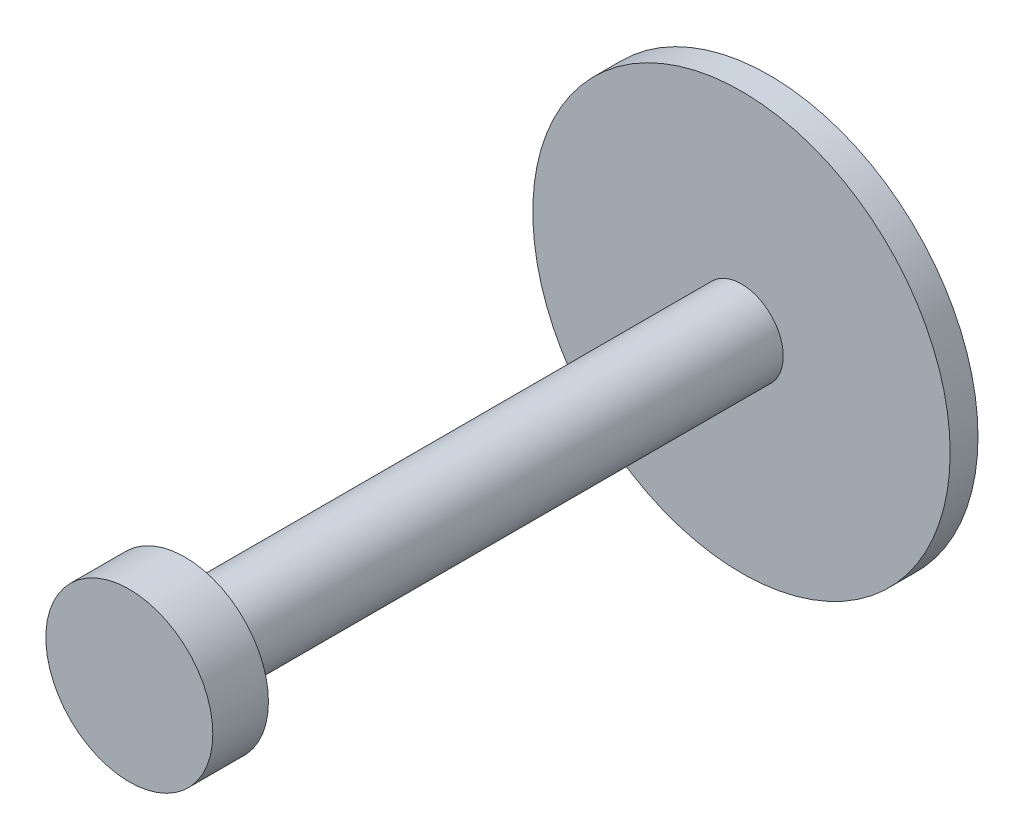
ISO-10303-21;
HEADER;
FILE_DESCRIPTION(('STEP AP214'),'2;1');
FILE_NAME('part.step','',(''),(''),'','','');
FILE_SCHEMA(('AUTOMOTIVE_DESIGN { 1 0 10303 214 1 1 1 1 }'));
ENDSEC;
DATA;
#1=APPLICATION_CONTEXT('core data for automotive mechanical design processes');
#2=APPLICATION_PROTOCOL_DEFINITION('international standard','automotive_design',2000,#1);
#3=PRODUCT_CONTEXT('',#1,'mechanical');
#4=PRODUCT('Part','Part','',(#3));
#5=PRODUCT_RELATED_PRODUCT_CATEGORY('part','',(#4));
#6=PRODUCT_DEFINITION_FORMATION('','',#4);
#7=PRODUCT_DEFINITION_CONTEXT('part definition',#1,'design');
#8=PRODUCT_DEFINITION('design','',#6,#7);
#9=PRODUCT_DEFINITION_SHAPE('','',#8);
#10=(LENGTH_UNIT() NAMED_UNIT(*) SI_UNIT(.MILLI.,.METRE.));
#11=(NAMED_UNIT(*) PLANE_ANGLE_UNIT() SI_UNIT($,.RADIAN.));
#12=(NAMED_UNIT(*) SI_UNIT($,.STERADIAN.) SOLID_ANGLE_UNIT());
#13=UNCERTAINTY_MEASURE_WITH_UNIT(LENGTH_MEASURE(1.E-05),#10,'distance_accuracy_value','');
#14=(GEOMETRIC_REPRESENTATION_CONTEXT(3) GLOBAL_UNCERTAINTY_ASSIGNED_CONTEXT((#13)) GLOBAL_UNIT_ASSIGNED_CONTEXT((#10,
#11,#12)) REPRESENTATION_CONTEXT('',''));
#15=CARTESIAN_POINT('',(0.,0.,0.));
#16=DIRECTION('',(0.,0.,1.));
#17=DIRECTION('',(1.,0.,0.));
#18=AXIS2_PLACEMENT_3D('',#15,#16,#17);
#19=CARTESIAN_POINT('',(0.,0.,10.));
#20=DIRECTION('',(0.,0.,1.));
#21=DIRECTION('',(1.,0.,0.));
#22=AXIS2_PLACEMENT_3D('',#19,#20,#21);
#23=PLANE('',#22);
#24=CARTESIAN_POINT('',(0.,0.,10.));
#25=DIRECTION('',(0.,0.,1.));
#26=DIRECTION('',(1.,0.,0.));
#27=AXIS2_PLACEMENT_3D('',#24,#25,#26);
#28=CIRCLE('',#27,75.);
#29=CARTESIAN_POINT('',(75.,0.,10.));
#30=VERTEX_POINT('',#29);
#31=EDGE_CURVE('E10',#30,#30,#28,.T.);
#32=ORIENTED_EDGE('',*,*,#31,.T.);
#33=EDGE_LOOP('',(#32));
#34=FACE_BOUND('',#33,.T.);
#35=CARTESIAN_POINT('',(0.,0.,10.));
#36=DIRECTION('',(0.,0.,1.));
#37=DIRECTION('',(1.,0.,0.));
#38=AXIS2_PLACEMENT_3D('',#35,#36,#37);
#39=CIRCLE('',#38,15.);
#40=CARTESIAN_POINT('',(15.,0.,10.));
#41=VERTEX_POINT('',#40);
#42=EDGE_CURVE('E45',#41,#41,#39,.T.);
#43=ORIENTED_EDGE('',*,*,#42,.F.);
#44=EDGE_LOOP('',(#43));
#45=FACE_BOUND('',#44,.T.);
#46=ADVANCED_FACE('F32',(#34,#45),#23,.T.);
#47=CARTESIAN_POINT('',(0.,0.,10.));
#48=DIRECTION('',(0.,0.,-1.));
#49=DIRECTION('',(-1.,0.,0.));
#50=AXIS2_PLACEMENT_3D('',#47,#48,#49);
#51=CYLINDRICAL_SURFACE('',#50,75.);
#52=ORIENTED_EDGE('',*,*,#31,.F.);
#53=EDGE_LOOP('',(#52));
#54=FACE_BOUND('',#53,.T.);
#55=CARTESIAN_POINT('',(0.,0.,0.));
#56=DIRECTION('',(0.,0.,1.));
#57=DIRECTION('',(1.,0.,0.));
#58=AXIS2_PLACEMENT_3D('',#55,#56,#57);
#59=CIRCLE('',#58,75.);
#60=CARTESIAN_POINT('',(75.,0.,0.));
#61=VERTEX_POINT('',#60);
#62=EDGE_CURVE('E36',#61,#61,#59,.T.);
#63=ORIENTED_EDGE('',*,*,#62,.T.);
#64=EDGE_LOOP('',(#63));
#65=FACE_BOUND('',#64,.T.);
#66=ADVANCED_FACE('F34',(#54,#65),#51,.T.);
#67=CARTESIAN_POINT('',(0.,0.,0.));
#68=DIRECTION('',(0.,0.,1.));
#69=DIRECTION('',(1.,0.,0.));
#70=AXIS2_PLACEMENT_3D('',#67,#68,#69);
#71=PLANE('',#70);
#72=ORIENTED_EDGE('',*,*,#62,.F.);
#73=EDGE_LOOP('',(#72));
#74=FACE_BOUND('',#73,.T.);
#75=ADVANCED_FACE('F74',(#74),#71,.F.);
#76=CARTESIAN_POINT('',(0.,0.,210.));
#77=DIRECTION('',(0.,0.,-1.));
#78=DIRECTION('',(-1.,0.,0.));
#79=AXIS2_PLACEMENT_3D('',#76,#77,#78);
#80=CYLINDRICAL_SURFACE('',#79,15.);
#81=CARTESIAN_POINT('',(0.,0.,210.));
#82=DIRECTION('',(0.,0.,1.));
#83=DIRECTION('',(1.,0.,0.));
#84=AXIS2_PLACEMENT_3D('',#81,#82,#83);
#85=CIRCLE('',#84,15.);
#86=CARTESIAN_POINT('',(15.,0.,210.));
#87=VERTEX_POINT('',#86);
#88=EDGE_CURVE('E43',#87,#87,#85,.T.);
#89=ORIENTED_EDGE('',*,*,#88,.F.);
#90=EDGE_LOOP('',(#89));
#91=FACE_BOUND('',#90,.T.);
#92=ORIENTED_EDGE('',*,*,#42,.T.);
#93=EDGE_LOOP('',(#92));
#94=FACE_BOUND('',#93,.T.);
#95=ADVANCED_FACE('F68',(#91,#94),#80,.T.);
#96=CARTESIAN_POINT('',(0.,0.,210.));
#97=DIRECTION('',(0.,0.,1.));
#98=DIRECTION('',(1.,0.,0.));
#99=AXIS2_PLACEMENT_3D('',#96,#97,#98);
#100=PLANE('',#99);
#101=CARTESIAN_POINT('',(0.,0.,210.));
#102=DIRECTION('',(0.,0.,1.));
#103=DIRECTION('',(1.,0.,0.));
#104=AXIS2_PLACEMENT_3D('',#101,#102,#103);
#105=CIRCLE('',#104,30.);
#106=CARTESIAN_POINT('',(30.,0.,210.));
#107=VERTEX_POINT('',#106);
#108=EDGE_CURVE('E51',#107,#107,#105,.T.);
#109=ORIENTED_EDGE('',*,*,#108,.F.);
#110=EDGE_LOOP('',(#109));
#111=FACE_BOUND('',#110,.T.);
#112=ORIENTED_EDGE('',*,*,#88,.T.);
#113=EDGE_LOOP('',(#112));
#114=FACE_BOUND('',#113,.T.);
#115=ADVANCED_FACE('F62',(#111,#114),#100,.F.);
#116=CARTESIAN_POINT('',(0.,0.,230.));
#117=DIRECTION('',(0.,0.,-1.));
#118=DIRECTION('',(-1.,0.,0.));
#119=AXIS2_PLACEMENT_3D('',#116,#117,#118);
#120=CYLINDRICAL_SURFACE('',#119,30.);
#121=CARTESIAN_POINT('',(0.,0.,230.));
#122=DIRECTION('',(0.,0.,1.));
#123=DIRECTION('',(1.,0.,0.));
#124=AXIS2_PLACEMENT_3D('',#121,#122,#123);
#125=CIRCLE('',#124,30.);
#126=CARTESIAN_POINT('',(30.,0.,230.));
#127=VERTEX_POINT('',#126);
#128=EDGE_CURVE('E48',#127,#127,#125,.T.);
#129=ORIENTED_EDGE('',*,*,#128,.F.);
#130=EDGE_LOOP('',(#129));
#131=FACE_BOUND('',#130,.T.);
#132=ORIENTED_EDGE('',*,*,#108,.T.);
#133=EDGE_LOOP('',(#132));
#134=FACE_BOUND('',#133,.T.);
#135=ADVANCED_FACE('F59',(#131,#134),#120,.T.);
#136=CARTESIAN_POINT('',(0.,0.,230.));
#137=DIRECTION('',(0.,0.,1.));
#138=DIRECTION('',(1.,0.,0.));
#139=AXIS2_PLACEMENT_3D('',#136,#137,#138);
#140=PLANE('',#139);
#141=ORIENTED_EDGE('',*,*,#128,.T.);
#142=EDGE_LOOP('',(#141));
#143=FACE_BOUND('',#142,.T.);
#144=ADVANCED_FACE('F57',(#143),#140,.T.);
#145=CLOSED_SHELL('',(#46,#66,#75,#95,#115,#135,#144));
#146=MANIFOLD_SOLID_BREP('B2',#145);
#147=ADVANCED_BREP_SHAPE_REPRESENTATION('',(#18,#146),#14);
#148=SHAPE_DEFINITION_REPRESENTATION(#9,#147);
ENDSEC;
END-ISO-10303-21;
